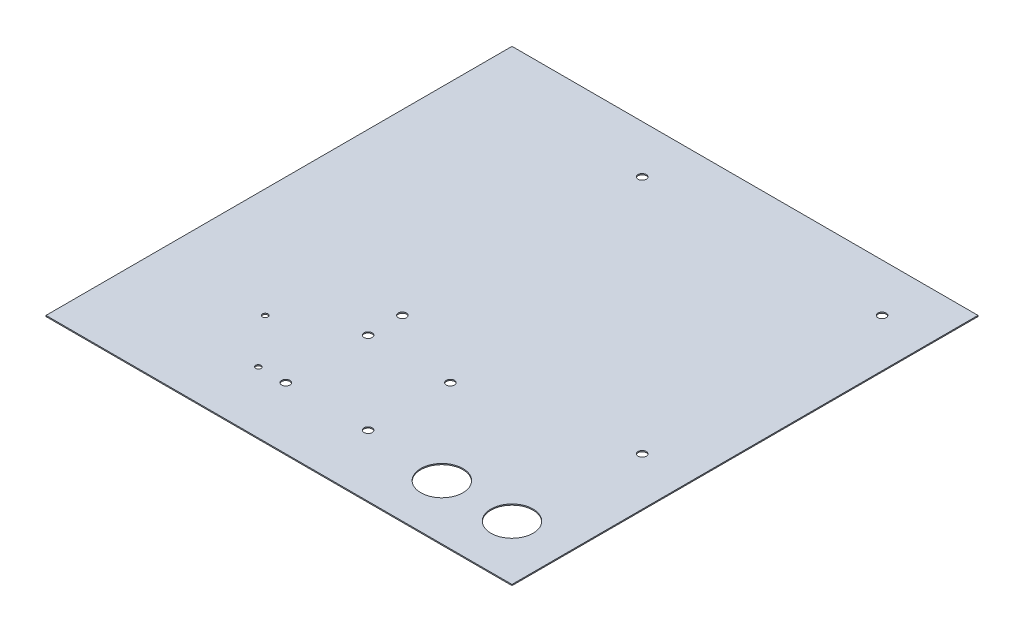
ISO-10303-21;
HEADER;
FILE_DESCRIPTION(('STEP AP214'),'2;1');
FILE_NAME('part.step','',(''),(''),'','','');
FILE_SCHEMA(('AUTOMOTIVE_DESIGN { 1 0 10303 214 1 1 1 1 }'));
ENDSEC;
DATA;
#1=APPLICATION_CONTEXT('core data for automotive mechanical design processes');
#2=APPLICATION_PROTOCOL_DEFINITION('international standard','automotive_design',2000,#1);
#3=PRODUCT_CONTEXT('',#1,'mechanical');
#4=PRODUCT('Part','Part','',(#3));
#5=PRODUCT_RELATED_PRODUCT_CATEGORY('part','',(#4));
#6=PRODUCT_DEFINITION_FORMATION('','',#4);
#7=PRODUCT_DEFINITION_CONTEXT('part definition',#1,'design');
#8=PRODUCT_DEFINITION('design','',#6,#7);
#9=PRODUCT_DEFINITION_SHAPE('','',#8);
#10=(LENGTH_UNIT() NAMED_UNIT(*) SI_UNIT(.MILLI.,.METRE.));
#11=(NAMED_UNIT(*) PLANE_ANGLE_UNIT() SI_UNIT($,.RADIAN.));
#12=(NAMED_UNIT(*) SI_UNIT($,.STERADIAN.) SOLID_ANGLE_UNIT());
#13=UNCERTAINTY_MEASURE_WITH_UNIT(LENGTH_MEASURE(1.E-05),#10,'distance_accuracy_value','');
#14=(GEOMETRIC_REPRESENTATION_CONTEXT(3) GLOBAL_UNCERTAINTY_ASSIGNED_CONTEXT((#13)) GLOBAL_UNIT_ASSIGNED_CONTEXT((#10,
#11,#12)) REPRESENTATION_CONTEXT('',''));
#15=CARTESIAN_POINT('',(0.,0.,0.));
#16=DIRECTION('',(0.,0.,1.));
#17=DIRECTION('',(1.,0.,0.));
#18=AXIS2_PLACEMENT_3D('',#15,#16,#17);
#19=CARTESIAN_POINT('',(-86.36,0.2032,86.36));
#20=DIRECTION('',(1.,0.,0.));
#21=DIRECTION('',(0.,0.,-1.));
#22=AXIS2_PLACEMENT_3D('',#19,#20,#21);
#23=PLANE('',#22);
#24=DIRECTION('',(0.,0.,-1.));
#25=VECTOR('',#24,1.);
#26=CARTESIAN_POINT('',(-86.36,0.2032,86.36));
#27=LINE('',#26,#25);
#28=CARTESIAN_POINT('',(-86.36,0.2032,86.36));
#29=VERTEX_POINT('',#28);
#30=CARTESIAN_POINT('',(-86.36,0.2032,-86.36));
#31=VERTEX_POINT('',#30);
#32=EDGE_CURVE('E93',#29,#31,#27,.T.);
#33=ORIENTED_EDGE('',*,*,#32,.T.);
#34=DIRECTION('',(0.,-1.,0.));
#35=VECTOR('',#34,1.);
#36=CARTESIAN_POINT('',(-86.36,0.2032,-86.36));
#37=LINE('',#36,#35);
#38=CARTESIAN_POINT('',(-86.36,-0.2032,-86.36));
#39=VERTEX_POINT('',#38);
#40=EDGE_CURVE('E88',#31,#39,#37,.T.);
#41=ORIENTED_EDGE('',*,*,#40,.T.);
#42=DIRECTION('',(0.,0.,-1.));
#43=VECTOR('',#42,1.);
#44=CARTESIAN_POINT('',(-86.36,-0.2032,86.36));
#45=LINE('',#44,#43);
#46=CARTESIAN_POINT('',(-86.36,-0.2032,86.36));
#47=VERTEX_POINT('',#46);
#48=EDGE_CURVE('E11',#47,#39,#45,.T.);
#49=ORIENTED_EDGE('',*,*,#48,.F.);
#50=DIRECTION('',(0.,-1.,0.));
#51=VECTOR('',#50,1.);
#52=CARTESIAN_POINT('',(-86.36,0.2032,86.36));
#53=LINE('',#52,#51);
#54=EDGE_CURVE('E106',#29,#47,#53,.T.);
#55=ORIENTED_EDGE('',*,*,#54,.F.);
#56=EDGE_LOOP('',(#33,#41,#49,#55));
#57=FACE_BOUND('',#56,.T.);
#58=ADVANCED_FACE('F36',(#57),#23,.F.);
#59=CARTESIAN_POINT('',(86.36,-0.2032,86.36));
#60=DIRECTION('',(0.,1.,0.));
#61=DIRECTION('',(0.,0.,1.));
#62=AXIS2_PLACEMENT_3D('',#59,#60,#61);
#63=PLANE('',#62);
#64=CARTESIAN_POINT('',(-20.32,-0.2032,33.02));
#65=DIRECTION('',(0.,-1.,0.));
#66=DIRECTION('',(0.,0.,-1.));
#67=AXIS2_PLACEMENT_3D('',#64,#65,#66);
#68=CIRCLE('',#67,1.524);
#69=CARTESIAN_POINT('',(-20.32,-0.2032,31.496));
#70=VERTEX_POINT('',#69);
#71=EDGE_CURVE('E142',#70,#70,#68,.T.);
#72=ORIENTED_EDGE('',*,*,#71,.F.);
#73=EDGE_LOOP('',(#72));
#74=FACE_BOUND('',#73,.T.);
#75=CARTESIAN_POINT('',(-30.48,-0.2032,63.52032));
#76=DIRECTION('',(0.,-1.,0.));
#77=DIRECTION('',(0.,0.,-1.));
#78=AXIS2_PLACEMENT_3D('',#75,#76,#77);
#79=CIRCLE('',#78,0.999999999999998);
#80=CARTESIAN_POINT('',(-30.48,-0.2032,62.52032));
#81=VERTEX_POINT('',#80);
#82=EDGE_CURVE('E146',#81,#81,#79,.T.);
#83=ORIENTED_EDGE('',*,*,#82,.F.);
#84=EDGE_LOOP('',(#83));
#85=FACE_BOUND('',#84,.T.);
#86=CARTESIAN_POINT('',(-20.32,-0.2032,63.52032));
#87=DIRECTION('',(0.,-1.,0.));
#88=DIRECTION('',(0.,0.,-1.));
#89=AXIS2_PLACEMENT_3D('',#86,#87,#88);
#90=CIRCLE('',#89,1.524);
#91=CARTESIAN_POINT('',(-20.32,-0.2032,61.99632));
#92=VERTEX_POINT('',#91);
#93=EDGE_CURVE('E150',#92,#92,#90,.T.);
#94=ORIENTED_EDGE('',*,*,#93,.F.);
#95=EDGE_LOOP('',(#94));
#96=FACE_BOUND('',#95,.T.);
#97=CARTESIAN_POINT('',(10.18032,-0.2032,63.52032));
#98=DIRECTION('',(0.,-1.,0.));
#99=DIRECTION('',(0.,0.,-1.));
#100=AXIS2_PLACEMENT_3D('',#97,#98,#99);
#101=CIRCLE('',#100,1.524);
#102=CARTESIAN_POINT('',(10.18032,-0.2032,61.99632));
#103=VERTEX_POINT('',#102);
#104=EDGE_CURVE('E154',#103,#103,#101,.T.);
#105=ORIENTED_EDGE('',*,*,#104,.F.);
#106=EDGE_LOOP('',(#105));
#107=FACE_BOUND('',#106,.T.);
#108=CARTESIAN_POINT('',(-45.72,-0.2032,45.7403215298174));
#109=DIRECTION('',(0.,-1.,0.));
#110=DIRECTION('',(0.,0.,-1.));
#111=AXIS2_PLACEMENT_3D('',#108,#109,#110);
#112=CIRCLE('',#111,0.999999999999998);
#113=CARTESIAN_POINT('',(-45.72,-0.2032,44.7403215298174));
#114=VERTEX_POINT('',#113);
#115=EDGE_CURVE('E158',#114,#114,#112,.T.);
#116=ORIENTED_EDGE('',*,*,#115,.F.);
#117=EDGE_LOOP('',(#116));
#118=FACE_BOUND('',#117,.T.);
#119=CARTESIAN_POINT('',(-20.32,-0.2032,-68.58));
#120=DIRECTION('',(0.,-1.,0.));
#121=DIRECTION('',(0.,0.,-1.));
#122=AXIS2_PLACEMENT_3D('',#119,#120,#121);
#123=CIRCLE('',#122,1.524);
#124=CARTESIAN_POINT('',(-20.32,-0.2032,-70.104));
#125=VERTEX_POINT('',#124);
#126=EDGE_CURVE('E162',#125,#125,#123,.T.);
#127=ORIENTED_EDGE('',*,*,#126,.F.);
#128=EDGE_LOOP('',(#127));
#129=FACE_BOUND('',#128,.T.);
#130=CARTESIAN_POINT('',(68.58,-0.2032,-68.58));
#131=DIRECTION('',(0.,-1.,0.));
#132=DIRECTION('',(0.,0.,-1.));
#133=AXIS2_PLACEMENT_3D('',#130,#131,#132);
#134=CIRCLE('',#133,1.52400000000001);
#135=CARTESIAN_POINT('',(68.58,-0.2032,-70.104));
#136=VERTEX_POINT('',#135);
#137=EDGE_CURVE('E166',#136,#136,#134,.T.);
#138=ORIENTED_EDGE('',*,*,#137,.F.);
#139=EDGE_LOOP('',(#138));
#140=FACE_BOUND('',#139,.T.);
#141=CARTESIAN_POINT('',(68.58,-0.2032,20.32));
#142=DIRECTION('',(0.,-1.,0.));
#143=DIRECTION('',(0.,0.,-1.));
#144=AXIS2_PLACEMENT_3D('',#141,#142,#143);
#145=CIRCLE('',#144,1.52400000000001);
#146=CARTESIAN_POINT('',(68.58,-0.2032,18.796));
#147=VERTEX_POINT('',#146);
#148=EDGE_CURVE('E170',#147,#147,#145,.T.);
#149=ORIENTED_EDGE('',*,*,#148,.F.);
#150=EDGE_LOOP('',(#149));
#151=FACE_BOUND('',#150,.T.);
#152=CARTESIAN_POINT('',(10.18032,-0.2032,33.02));
#153=DIRECTION('',(0.,-1.,0.));
#154=DIRECTION('',(0.,0.,-1.));
#155=AXIS2_PLACEMENT_3D('',#152,#153,#154);
#156=CIRCLE('',#155,1.524);
#157=CARTESIAN_POINT('',(10.18032,-0.2032,31.496));
#158=VERTEX_POINT('',#157);
#159=EDGE_CURVE('E174',#158,#158,#156,.T.);
#160=ORIENTED_EDGE('',*,*,#159,.F.);
#161=EDGE_LOOP('',(#160));
#162=FACE_BOUND('',#161,.T.);
#163=CARTESIAN_POINT('',(-20.32,-0.2032,20.32));
#164=DIRECTION('',(0.,-1.,0.));
#165=DIRECTION('',(0.,0.,-1.));
#166=AXIS2_PLACEMENT_3D('',#163,#164,#165);
#167=CIRCLE('',#166,1.52399999999999);
#168=CARTESIAN_POINT('',(-20.32,-0.2032,18.796));
#169=VERTEX_POINT('',#168);
#170=EDGE_CURVE('E178',#169,#169,#167,.T.);
#171=ORIENTED_EDGE('',*,*,#170,.F.);
#172=EDGE_LOOP('',(#171));
#173=FACE_BOUND('',#172,.T.);
#174=CARTESIAN_POINT('',(40.04,-0.2032,66.04));
#175=DIRECTION('',(0.,1.,0.));
#176=DIRECTION('',(0.,0.,1.));
#177=AXIS2_PLACEMENT_3D('',#174,#175,#176);
#178=CIRCLE('',#177,7.80000002100001);
#179=CARTESIAN_POINT('',(40.04,-0.2032,73.840000021));
#180=VERTEX_POINT('',#179);
#181=EDGE_CURVE('E94',#180,#180,#178,.T.);
#182=ORIENTED_EDGE('',*,*,#181,.T.);
#183=EDGE_LOOP('',(#182));
#184=FACE_BOUND('',#183,.T.);
#185=CARTESIAN_POINT('',(66.04,-0.2032,66.04));
#186=DIRECTION('',(0.,1.,0.));
#187=DIRECTION('',(0.,0.,1.));
#188=AXIS2_PLACEMENT_3D('',#185,#186,#187);
#189=CIRCLE('',#188,7.80000002099999);
#190=CARTESIAN_POINT('',(66.04,-0.2032,73.840000021));
#191=VERTEX_POINT('',#190);
#192=EDGE_CURVE('E183',#191,#191,#189,.T.);
#193=ORIENTED_EDGE('',*,*,#192,.T.);
#194=EDGE_LOOP('',(#193));
#195=FACE_BOUND('',#194,.T.);
#196=ORIENTED_EDGE('',*,*,#48,.T.);
#197=DIRECTION('',(1.,0.,0.));
#198=VECTOR('',#197,1.);
#199=CARTESIAN_POINT('',(86.36,-0.2032,-86.36));
#200=LINE('',#199,#198);
#201=CARTESIAN_POINT('',(86.36,-0.2032,-86.36));
#202=VERTEX_POINT('',#201);
#203=EDGE_CURVE('E78',#39,#202,#200,.T.);
#204=ORIENTED_EDGE('',*,*,#203,.T.);
#205=DIRECTION('',(0.,0.,-1.));
#206=VECTOR('',#205,1.);
#207=CARTESIAN_POINT('',(86.36,-0.2032,86.36));
#208=LINE('',#207,#206);
#209=CARTESIAN_POINT('',(86.36,-0.2032,86.36));
#210=VERTEX_POINT('',#209);
#211=EDGE_CURVE('E43',#210,#202,#208,.T.);
#212=ORIENTED_EDGE('',*,*,#211,.F.);
#213=DIRECTION('',(1.,0.,0.));
#214=VECTOR('',#213,1.);
#215=CARTESIAN_POINT('',(86.36,-0.2032,86.36));
#216=LINE('',#215,#214);
#217=EDGE_CURVE('E79',#47,#210,#216,.T.);
#218=ORIENTED_EDGE('',*,*,#217,.F.);
#219=EDGE_LOOP('',(#196,#204,#212,#218));
#220=FACE_BOUND('',#219,.T.);
#221=ADVANCED_FACE('F76',(#74,#85,#96,#107,#118,#129,#140,#151,#162,#173,#184,#195,#220),#63,.F.);
#222=CARTESIAN_POINT('',(86.36,0.2032,86.36));
#223=DIRECTION('',(-1.,0.,0.));
#224=DIRECTION('',(0.,0.,1.));
#225=AXIS2_PLACEMENT_3D('',#222,#223,#224);
#226=PLANE('',#225);
#227=ORIENTED_EDGE('',*,*,#211,.T.);
#228=DIRECTION('',(0.,1.,0.));
#229=VECTOR('',#228,1.);
#230=CARTESIAN_POINT('',(86.36,0.2032,-86.36));
#231=LINE('',#230,#229);
#232=CARTESIAN_POINT('',(86.36,0.2032,-86.36));
#233=VERTEX_POINT('',#232);
#234=EDGE_CURVE('E91',#202,#233,#231,.T.);
#235=ORIENTED_EDGE('',*,*,#234,.T.);
#236=DIRECTION('',(0.,0.,-1.));
#237=VECTOR('',#236,1.);
#238=CARTESIAN_POINT('',(86.36,0.2032,86.36));
#239=LINE('',#238,#237);
#240=CARTESIAN_POINT('',(86.36,0.2032,86.36));
#241=VERTEX_POINT('',#240);
#242=EDGE_CURVE('E112',#241,#233,#239,.T.);
#243=ORIENTED_EDGE('',*,*,#242,.F.);
#244=DIRECTION('',(0.,1.,0.));
#245=VECTOR('',#244,1.);
#246=CARTESIAN_POINT('',(86.36,0.2032,86.36));
#247=LINE('',#246,#245);
#248=EDGE_CURVE('E55',#210,#241,#247,.T.);
#249=ORIENTED_EDGE('',*,*,#248,.F.);
#250=EDGE_LOOP('',(#227,#235,#243,#249));
#251=FACE_BOUND('',#250,.T.);
#252=ADVANCED_FACE('F114',(#251),#226,.F.);
#253=CARTESIAN_POINT('',(86.36,0.2032,86.36));
#254=DIRECTION('',(0.,-1.,0.));
#255=DIRECTION('',(0.,0.,-1.));
#256=AXIS2_PLACEMENT_3D('',#253,#254,#255);
#257=PLANE('',#256);
#258=CARTESIAN_POINT('',(-20.32,0.2032,33.02));
#259=DIRECTION('',(0.,-1.,0.));
#260=DIRECTION('',(0.,0.,-1.));
#261=AXIS2_PLACEMENT_3D('',#258,#259,#260);
#262=CIRCLE('',#261,1.524);
#263=CARTESIAN_POINT('',(-20.32,0.2032,31.496));
#264=VERTEX_POINT('',#263);
#265=EDGE_CURVE('E196',#264,#264,#262,.T.);
#266=ORIENTED_EDGE('',*,*,#265,.T.);
#267=EDGE_LOOP('',(#266));
#268=FACE_BOUND('',#267,.T.);
#269=CARTESIAN_POINT('',(-30.48,0.2032,63.52032));
#270=DIRECTION('',(0.,-1.,0.));
#271=DIRECTION('',(0.,0.,-1.));
#272=AXIS2_PLACEMENT_3D('',#269,#270,#271);
#273=CIRCLE('',#272,0.999999999999998);
#274=CARTESIAN_POINT('',(-30.48,0.2032,62.52032));
#275=VERTEX_POINT('',#274);
#276=EDGE_CURVE('E211',#275,#275,#273,.T.);
#277=ORIENTED_EDGE('',*,*,#276,.T.);
#278=EDGE_LOOP('',(#277));
#279=FACE_BOUND('',#278,.T.);
#280=CARTESIAN_POINT('',(-20.32,0.2032,63.52032));
#281=DIRECTION('',(0.,-1.,0.));
#282=DIRECTION('',(0.,0.,-1.));
#283=AXIS2_PLACEMENT_3D('',#280,#281,#282);
#284=CIRCLE('',#283,1.524);
#285=CARTESIAN_POINT('',(-20.32,0.2032,61.99632));
#286=VERTEX_POINT('',#285);
#287=EDGE_CURVE('E212',#286,#286,#284,.T.);
#288=ORIENTED_EDGE('',*,*,#287,.T.);
#289=EDGE_LOOP('',(#288));
#290=FACE_BOUND('',#289,.T.);
#291=CARTESIAN_POINT('',(10.18032,0.2032,63.52032));
#292=DIRECTION('',(0.,-1.,0.));
#293=DIRECTION('',(0.,0.,-1.));
#294=AXIS2_PLACEMENT_3D('',#291,#292,#293);
#295=CIRCLE('',#294,1.524);
#296=CARTESIAN_POINT('',(10.18032,0.2032,61.99632));
#297=VERTEX_POINT('',#296);
#298=EDGE_CURVE('E219',#297,#297,#295,.T.);
#299=ORIENTED_EDGE('',*,*,#298,.T.);
#300=EDGE_LOOP('',(#299));
#301=FACE_BOUND('',#300,.T.);
#302=CARTESIAN_POINT('',(-45.72,0.2032,45.7403215298174));
#303=DIRECTION('',(0.,-1.,0.));
#304=DIRECTION('',(0.,0.,-1.));
#305=AXIS2_PLACEMENT_3D('',#302,#303,#304);
#306=CIRCLE('',#305,0.999999999999998);
#307=CARTESIAN_POINT('',(-45.72,0.2032,44.7403215298174));
#308=VERTEX_POINT('',#307);
#309=EDGE_CURVE('E195',#308,#308,#306,.T.);
#310=ORIENTED_EDGE('',*,*,#309,.T.);
#311=EDGE_LOOP('',(#310));
#312=FACE_BOUND('',#311,.T.);
#313=CARTESIAN_POINT('',(-20.32,0.2032,-68.58));
#314=DIRECTION('',(0.,-1.,0.));
#315=DIRECTION('',(0.,0.,-1.));
#316=AXIS2_PLACEMENT_3D('',#313,#314,#315);
#317=CIRCLE('',#316,1.524);
#318=CARTESIAN_POINT('',(-20.32,0.2032,-70.104));
#319=VERTEX_POINT('',#318);
#320=EDGE_CURVE('E200',#319,#319,#317,.T.);
#321=ORIENTED_EDGE('',*,*,#320,.T.);
#322=EDGE_LOOP('',(#321));
#323=FACE_BOUND('',#322,.T.);
#324=CARTESIAN_POINT('',(68.58,0.2032,-68.58));
#325=DIRECTION('',(0.,-1.,0.));
#326=DIRECTION('',(0.,0.,-1.));
#327=AXIS2_PLACEMENT_3D('',#324,#325,#326);
#328=CIRCLE('',#327,1.52400000000001);
#329=CARTESIAN_POINT('',(68.58,0.2032,-70.104));
#330=VERTEX_POINT('',#329);
#331=EDGE_CURVE('E204',#330,#330,#328,.T.);
#332=ORIENTED_EDGE('',*,*,#331,.T.);
#333=EDGE_LOOP('',(#332));
#334=FACE_BOUND('',#333,.T.);
#335=CARTESIAN_POINT('',(68.58,0.2032,20.32));
#336=DIRECTION('',(0.,-1.,0.));
#337=DIRECTION('',(0.,0.,-1.));
#338=AXIS2_PLACEMENT_3D('',#335,#336,#337);
#339=CIRCLE('',#338,1.52400000000001);
#340=CARTESIAN_POINT('',(68.58,0.2032,18.796));
#341=VERTEX_POINT('',#340);
#342=EDGE_CURVE('E191',#341,#341,#339,.T.);
#343=ORIENTED_EDGE('',*,*,#342,.T.);
#344=EDGE_LOOP('',(#343));
#345=FACE_BOUND('',#344,.T.);
#346=CARTESIAN_POINT('',(10.18032,0.2032,33.02));
#347=DIRECTION('',(0.,-1.,0.));
#348=DIRECTION('',(0.,0.,-1.));
#349=AXIS2_PLACEMENT_3D('',#346,#347,#348);
#350=CIRCLE('',#349,1.524);
#351=CARTESIAN_POINT('',(10.18032,0.2032,31.496));
#352=VERTEX_POINT('',#351);
#353=EDGE_CURVE('E220',#352,#352,#350,.T.);
#354=ORIENTED_EDGE('',*,*,#353,.T.);
#355=EDGE_LOOP('',(#354));
#356=FACE_BOUND('',#355,.T.);
#357=CARTESIAN_POINT('',(-20.32,0.2032,20.32));
#358=DIRECTION('',(0.,-1.,0.));
#359=DIRECTION('',(0.,0.,-1.));
#360=AXIS2_PLACEMENT_3D('',#357,#358,#359);
#361=CIRCLE('',#360,1.52399999999999);
#362=CARTESIAN_POINT('',(-20.32,0.2032,18.796));
#363=VERTEX_POINT('',#362);
#364=EDGE_CURVE('E188',#363,#363,#361,.T.);
#365=ORIENTED_EDGE('',*,*,#364,.T.);
#366=EDGE_LOOP('',(#365));
#367=FACE_BOUND('',#366,.T.);
#368=CARTESIAN_POINT('',(40.04,0.2032,66.04));
#369=DIRECTION('',(0.,1.,0.));
#370=DIRECTION('',(0.,0.,1.));
#371=AXIS2_PLACEMENT_3D('',#368,#369,#370);
#372=CIRCLE('',#371,7.80000002100001);
#373=CARTESIAN_POINT('',(40.04,0.2032,73.840000021));
#374=VERTEX_POINT('',#373);
#375=EDGE_CURVE('E97',#374,#374,#372,.T.);
#376=ORIENTED_EDGE('',*,*,#375,.F.);
#377=EDGE_LOOP('',(#376));
#378=FACE_BOUND('',#377,.T.);
#379=CARTESIAN_POINT('',(66.04,0.2032,66.04));
#380=DIRECTION('',(0.,1.,0.));
#381=DIRECTION('',(0.,0.,1.));
#382=AXIS2_PLACEMENT_3D('',#379,#380,#381);
#383=CIRCLE('',#382,7.80000002099999);
#384=CARTESIAN_POINT('',(66.04,0.2032,73.840000021));
#385=VERTEX_POINT('',#384);
#386=EDGE_CURVE('E100',#385,#385,#383,.T.);
#387=ORIENTED_EDGE('',*,*,#386,.F.);
#388=EDGE_LOOP('',(#387));
#389=FACE_BOUND('',#388,.T.);
#390=ORIENTED_EDGE('',*,*,#242,.T.);
#391=DIRECTION('',(-1.,0.,0.));
#392=VECTOR('',#391,1.);
#393=CARTESIAN_POINT('',(86.36,0.2032,-86.36));
#394=LINE('',#393,#392);
#395=EDGE_CURVE('E104',#233,#31,#394,.T.);
#396=ORIENTED_EDGE('',*,*,#395,.T.);
#397=ORIENTED_EDGE('',*,*,#32,.F.);
#398=DIRECTION('',(-1.,0.,0.));
#399=VECTOR('',#398,1.);
#400=CARTESIAN_POINT('',(86.36,0.2032,86.36));
#401=LINE('',#400,#399);
#402=EDGE_CURVE('E50',#241,#29,#401,.T.);
#403=ORIENTED_EDGE('',*,*,#402,.F.);
#404=EDGE_LOOP('',(#390,#396,#397,#403));
#405=FACE_BOUND('',#404,.T.);
#406=ADVANCED_FACE('F116',(#268,#279,#290,#301,#312,#323,#334,#345,#356,#367,#378,#389,#405),
#257,.F.);
#407=CARTESIAN_POINT('',(0.,0.,86.36));
#408=DIRECTION('',(0.,0.,-1.));
#409=DIRECTION('',(-1.,0.,0.));
#410=AXIS2_PLACEMENT_3D('',#407,#408,#409);
#411=PLANE('',#410);
#412=ORIENTED_EDGE('',*,*,#54,.T.);
#413=ORIENTED_EDGE('',*,*,#217,.T.);
#414=ORIENTED_EDGE('',*,*,#248,.T.);
#415=ORIENTED_EDGE('',*,*,#402,.T.);
#416=EDGE_LOOP('',(#412,#413,#414,#415));
#417=FACE_BOUND('',#416,.T.);
#418=ADVANCED_FACE('F117',(#417),#411,.F.);
#419=CARTESIAN_POINT('',(0.,0.,-86.36));
#420=DIRECTION('',(0.,0.,-1.));
#421=DIRECTION('',(-1.,0.,0.));
#422=AXIS2_PLACEMENT_3D('',#419,#420,#421);
#423=PLANE('',#422);
#424=ORIENTED_EDGE('',*,*,#40,.F.);
#425=ORIENTED_EDGE('',*,*,#395,.F.);
#426=ORIENTED_EDGE('',*,*,#234,.F.);
#427=ORIENTED_EDGE('',*,*,#203,.F.);
#428=EDGE_LOOP('',(#424,#425,#426,#427));
#429=FACE_BOUND('',#428,.T.);
#430=ADVANCED_FACE('F86',(#429),#423,.T.);
#431=CARTESIAN_POINT('',(66.04,-0.2032,66.04));
#432=DIRECTION('',(0.,1.,0.));
#433=DIRECTION('',(0.,0.,1.));
#434=AXIS2_PLACEMENT_3D('',#431,#432,#433);
#435=CYLINDRICAL_SURFACE('',#434,7.80000002099999);
#436=ORIENTED_EDGE('',*,*,#192,.F.);
#437=EDGE_LOOP('',(#436));
#438=FACE_BOUND('',#437,.T.);
#439=ORIENTED_EDGE('',*,*,#386,.T.);
#440=EDGE_LOOP('',(#439));
#441=FACE_BOUND('',#440,.T.);
#442=ADVANCED_FACE('F124',(#438,#441),#435,.F.);
#443=CARTESIAN_POINT('',(40.04,-0.2032,66.04));
#444=DIRECTION('',(0.,1.,0.));
#445=DIRECTION('',(0.,0.,1.));
#446=AXIS2_PLACEMENT_3D('',#443,#444,#445);
#447=CYLINDRICAL_SURFACE('',#446,7.80000002100001);
#448=ORIENTED_EDGE('',*,*,#181,.F.);
#449=EDGE_LOOP('',(#448));
#450=FACE_BOUND('',#449,.T.);
#451=ORIENTED_EDGE('',*,*,#375,.T.);
#452=EDGE_LOOP('',(#451));
#453=FACE_BOUND('',#452,.T.);
#454=ADVANCED_FACE('F245',(#450,#453),#447,.F.);
#455=CARTESIAN_POINT('',(-20.32,0.2032,20.32));
#456=DIRECTION('',(0.,-1.,0.));
#457=DIRECTION('',(0.,0.,-1.));
#458=AXIS2_PLACEMENT_3D('',#455,#456,#457);
#459=CYLINDRICAL_SURFACE('',#458,1.52399999999999);
#460=ORIENTED_EDGE('',*,*,#364,.F.);
#461=EDGE_LOOP('',(#460));
#462=FACE_BOUND('',#461,.T.);
#463=ORIENTED_EDGE('',*,*,#170,.T.);
#464=EDGE_LOOP('',(#463));
#465=FACE_BOUND('',#464,.T.);
#466=ADVANCED_FACE('F236',(#462,#465),#459,.F.);
#467=CARTESIAN_POINT('',(10.18032,0.2032,33.02));
#468=DIRECTION('',(0.,-1.,0.));
#469=DIRECTION('',(0.,0.,-1.));
#470=AXIS2_PLACEMENT_3D('',#467,#468,#469);
#471=CYLINDRICAL_SURFACE('',#470,1.524);
#472=ORIENTED_EDGE('',*,*,#353,.F.);
#473=EDGE_LOOP('',(#472));
#474=FACE_BOUND('',#473,.T.);
#475=ORIENTED_EDGE('',*,*,#159,.T.);
#476=EDGE_LOOP('',(#475));
#477=FACE_BOUND('',#476,.T.);
#478=ADVANCED_FACE('F232',(#474,#477),#471,.F.);
#479=CARTESIAN_POINT('',(68.58,0.2032,20.32));
#480=DIRECTION('',(0.,-1.,0.));
#481=DIRECTION('',(0.,0.,-1.));
#482=AXIS2_PLACEMENT_3D('',#479,#480,#481);
#483=CYLINDRICAL_SURFACE('',#482,1.52400000000001);
#484=ORIENTED_EDGE('',*,*,#342,.F.);
#485=EDGE_LOOP('',(#484));
#486=FACE_BOUND('',#485,.T.);
#487=ORIENTED_EDGE('',*,*,#148,.T.);
#488=EDGE_LOOP('',(#487));
#489=FACE_BOUND('',#488,.T.);
#490=ADVANCED_FACE('F235',(#486,#489),#483,.F.);
#491=CARTESIAN_POINT('',(68.58,0.2032,-68.58));
#492=DIRECTION('',(0.,-1.,0.));
#493=DIRECTION('',(0.,0.,-1.));
#494=AXIS2_PLACEMENT_3D('',#491,#492,#493);
#495=CYLINDRICAL_SURFACE('',#494,1.52400000000001);
#496=ORIENTED_EDGE('',*,*,#331,.F.);
#497=EDGE_LOOP('',(#496));
#498=FACE_BOUND('',#497,.T.);
#499=ORIENTED_EDGE('',*,*,#137,.T.);
#500=EDGE_LOOP('',(#499));
#501=FACE_BOUND('',#500,.T.);
#502=ADVANCED_FACE('F242',(#498,#501),#495,.F.);
#503=CARTESIAN_POINT('',(-20.32,0.2032,-68.58));
#504=DIRECTION('',(0.,-1.,0.));
#505=DIRECTION('',(0.,0.,-1.));
#506=AXIS2_PLACEMENT_3D('',#503,#504,#505);
#507=CYLINDRICAL_SURFACE('',#506,1.524);
#508=ORIENTED_EDGE('',*,*,#320,.F.);
#509=EDGE_LOOP('',(#508));
#510=FACE_BOUND('',#509,.T.);
#511=ORIENTED_EDGE('',*,*,#126,.T.);
#512=EDGE_LOOP('',(#511));
#513=FACE_BOUND('',#512,.T.);
#514=ADVANCED_FACE('F268',(#510,#513),#507,.F.);
#515=CARTESIAN_POINT('',(-45.72,0.2032,45.7403215298174));
#516=DIRECTION('',(0.,-1.,0.));
#517=DIRECTION('',(0.,0.,-1.));
#518=AXIS2_PLACEMENT_3D('',#515,#516,#517);
#519=CYLINDRICAL_SURFACE('',#518,0.999999999999998);
#520=ORIENTED_EDGE('',*,*,#309,.F.);
#521=EDGE_LOOP('',(#520));
#522=FACE_BOUND('',#521,.T.);
#523=ORIENTED_EDGE('',*,*,#115,.T.);
#524=EDGE_LOOP('',(#523));
#525=FACE_BOUND('',#524,.T.);
#526=ADVANCED_FACE('F257',(#522,#525),#519,.F.);
#527=CARTESIAN_POINT('',(10.18032,0.2032,63.52032));
#528=DIRECTION('',(0.,-1.,0.));
#529=DIRECTION('',(0.,0.,-1.));
#530=AXIS2_PLACEMENT_3D('',#527,#528,#529);
#531=CYLINDRICAL_SURFACE('',#530,1.524);
#532=ORIENTED_EDGE('',*,*,#298,.F.);
#533=EDGE_LOOP('',(#532));
#534=FACE_BOUND('',#533,.T.);
#535=ORIENTED_EDGE('',*,*,#104,.T.);
#536=EDGE_LOOP('',(#535));
#537=FACE_BOUND('',#536,.T.);
#538=ADVANCED_FACE('F253',(#534,#537),#531,.F.);
#539=CARTESIAN_POINT('',(-20.32,0.2032,63.52032));
#540=DIRECTION('',(0.,-1.,0.));
#541=DIRECTION('',(0.,0.,-1.));
#542=AXIS2_PLACEMENT_3D('',#539,#540,#541);
#543=CYLINDRICAL_SURFACE('',#542,1.524);
#544=ORIENTED_EDGE('',*,*,#287,.F.);
#545=EDGE_LOOP('',(#544));
#546=FACE_BOUND('',#545,.T.);
#547=ORIENTED_EDGE('',*,*,#93,.T.);
#548=EDGE_LOOP('',(#547));
#549=FACE_BOUND('',#548,.T.);
#550=ADVANCED_FACE('F249',(#546,#549),#543,.F.);
#551=CARTESIAN_POINT('',(-30.48,0.2032,63.52032));
#552=DIRECTION('',(0.,-1.,0.));
#553=DIRECTION('',(0.,0.,-1.));
#554=AXIS2_PLACEMENT_3D('',#551,#552,#553);
#555=CYLINDRICAL_SURFACE('',#554,0.999999999999998);
#556=ORIENTED_EDGE('',*,*,#276,.F.);
#557=EDGE_LOOP('',(#556));
#558=FACE_BOUND('',#557,.T.);
#559=ORIENTED_EDGE('',*,*,#82,.T.);
#560=EDGE_LOOP('',(#559));
#561=FACE_BOUND('',#560,.T.);
#562=ADVANCED_FACE('F252',(#558,#561),#555,.F.);
#563=CARTESIAN_POINT('',(-20.32,0.2032,33.02));
#564=DIRECTION('',(0.,-1.,0.));
#565=DIRECTION('',(0.,0.,-1.));
#566=AXIS2_PLACEMENT_3D('',#563,#564,#565);
#567=CYLINDRICAL_SURFACE('',#566,1.524);
#568=ORIENTED_EDGE('',*,*,#265,.F.);
#569=EDGE_LOOP('',(#568));
#570=FACE_BOUND('',#569,.T.);
#571=ORIENTED_EDGE('',*,*,#71,.T.);
#572=EDGE_LOOP('',(#571));
#573=FACE_BOUND('',#572,.T.);
#574=ADVANCED_FACE('F259',(#570,#573),#567,.F.);
#575=CLOSED_SHELL('',(#58,#221,#252,#406,#418,#430,#442,#454,#466,#478,#490,#502,#514,#526,#538,
#550,#562,#574));
#576=MANIFOLD_SOLID_BREP('B2',#575);
#577=ADVANCED_BREP_SHAPE_REPRESENTATION('',(#18,#576),#14);
#578=SHAPE_DEFINITION_REPRESENTATION(#9,#577);
ENDSEC;
END-ISO-10303-21;
